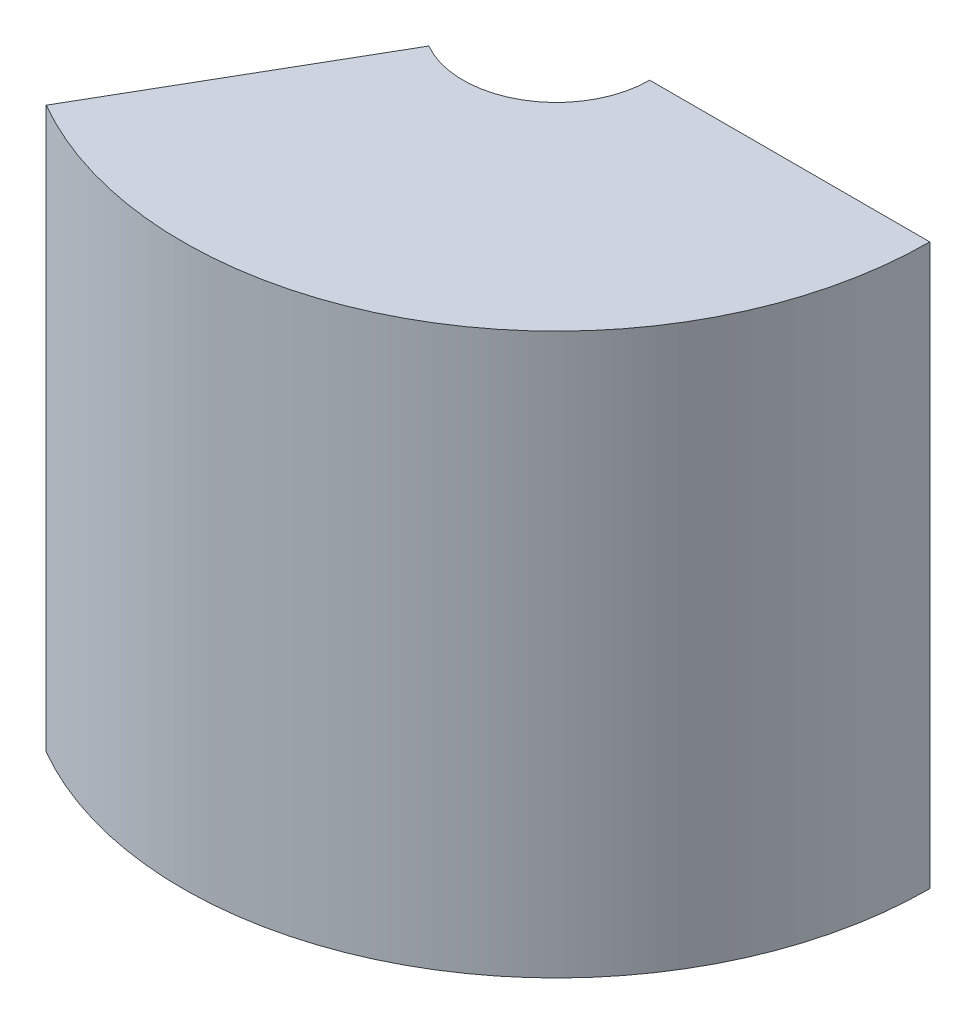
ISO-10303-21;
HEADER;
FILE_DESCRIPTION(('STEP AP214'),'2;1');
FILE_NAME('part.step','',(''),(''),'','','');
FILE_SCHEMA(('AUTOMOTIVE_DESIGN { 1 0 10303 214 1 1 1 1 }'));
ENDSEC;
DATA;
#1=APPLICATION_CONTEXT('core data for automotive mechanical design processes');
#2=APPLICATION_PROTOCOL_DEFINITION('international standard','automotive_design',2000,#1);
#3=PRODUCT_CONTEXT('',#1,'mechanical');
#4=PRODUCT('Part','Part','',(#3));
#5=PRODUCT_RELATED_PRODUCT_CATEGORY('part','',(#4));
#6=PRODUCT_DEFINITION_FORMATION('','',#4);
#7=PRODUCT_DEFINITION_CONTEXT('part definition',#1,'design');
#8=PRODUCT_DEFINITION('design','',#6,#7);
#9=PRODUCT_DEFINITION_SHAPE('','',#8);
#10=(LENGTH_UNIT() NAMED_UNIT(*) SI_UNIT(.MILLI.,.METRE.));
#11=(NAMED_UNIT(*) PLANE_ANGLE_UNIT() SI_UNIT($,.RADIAN.));
#12=(NAMED_UNIT(*) SI_UNIT($,.STERADIAN.) SOLID_ANGLE_UNIT());
#13=UNCERTAINTY_MEASURE_WITH_UNIT(LENGTH_MEASURE(1.E-05),#10,'distance_accuracy_value','');
#14=(GEOMETRIC_REPRESENTATION_CONTEXT(3) GLOBAL_UNCERTAINTY_ASSIGNED_CONTEXT((#13)) GLOBAL_UNIT_ASSIGNED_CONTEXT((#10,
#11,#12)) REPRESENTATION_CONTEXT('',''));
#15=CARTESIAN_POINT('',(0.,0.,0.));
#16=DIRECTION('',(0.,0.,1.));
#17=DIRECTION('',(1.,0.,0.));
#18=AXIS2_PLACEMENT_3D('',#15,#16,#17);
#19=CARTESIAN_POINT('',(0.,0.,0.));
#20=DIRECTION('',(0.,1.,0.));
#21=DIRECTION('',(0.,0.,1.));
#22=AXIS2_PLACEMENT_3D('',#19,#20,#21);
#23=CYLINDRICAL_SURFACE('',#22,5.);
#24=CARTESIAN_POINT('',(0.,0.,0.));
#25=DIRECTION('',(0.,1.,0.));
#26=DIRECTION('',(0.,0.,1.));
#27=AXIS2_PLACEMENT_3D('',#24,#25,#26);
#28=CIRCLE('',#27,5.);
#29=CARTESIAN_POINT('',(-2.5,0.,4.33012701892219));
#30=VERTEX_POINT('',#29);
#31=CARTESIAN_POINT('',(5.,0.,0.));
#32=VERTEX_POINT('',#31);
#33=EDGE_CURVE('E11',#30,#32,#28,.T.);
#34=ORIENTED_EDGE('',*,*,#33,.F.);
#35=DIRECTION('',(0.,-1.,0.));
#36=VECTOR('',#35,1.);
#37=CARTESIAN_POINT('',(-2.5,30.,4.33012701892219));
#38=LINE('',#37,#36);
#39=CARTESIAN_POINT('',(-2.5,30.,4.33012701892219));
#40=VERTEX_POINT('',#39);
#41=EDGE_CURVE('E103',#40,#30,#38,.T.);
#42=ORIENTED_EDGE('',*,*,#41,.F.);
#43=CARTESIAN_POINT('',(0.,30.,0.));
#44=DIRECTION('',(0.,1.,0.));
#45=DIRECTION('',(0.,0.,1.));
#46=AXIS2_PLACEMENT_3D('',#43,#44,#45);
#47=CIRCLE('',#46,5.);
#48=CARTESIAN_POINT('',(5.,30.,0.));
#49=VERTEX_POINT('',#48);
#50=EDGE_CURVE('E56',#40,#49,#47,.T.);
#51=ORIENTED_EDGE('',*,*,#50,.T.);
#52=DIRECTION('',(0.,-1.,0.));
#53=VECTOR('',#52,1.);
#54=CARTESIAN_POINT('',(5.,30.,0.));
#55=LINE('',#54,#53);
#56=EDGE_CURVE('E92',#49,#32,#55,.T.);
#57=ORIENTED_EDGE('',*,*,#56,.T.);
#58=EDGE_LOOP('',(#34,#42,#51,#57));
#59=FACE_BOUND('',#58,.T.);
#60=ADVANCED_FACE('F41',(#59),#23,.F.);
#61=CARTESIAN_POINT('',(-2.5,0.,4.33012701892219));
#62=DIRECTION('',(0.,1.,0.));
#63=DIRECTION('',(0.,0.,1.));
#64=AXIS2_PLACEMENT_3D('',#61,#62,#63);
#65=PLANE('',#64);
#66=CARTESIAN_POINT('',(0.,0.,0.));
#67=DIRECTION('',(0.,1.,0.));
#68=DIRECTION('',(0.,0.,1.));
#69=AXIS2_PLACEMENT_3D('',#66,#67,#68);
#70=CIRCLE('',#69,20.);
#71=CARTESIAN_POINT('',(-9.99999999999999,0.,17.3205080756888));
#72=VERTEX_POINT('',#71);
#73=CARTESIAN_POINT('',(20.,0.,0.));
#74=VERTEX_POINT('',#73);
#75=EDGE_CURVE('E49',#72,#74,#70,.T.);
#76=ORIENTED_EDGE('',*,*,#75,.F.);
#77=DIRECTION('',(-0.5,0.,0.866025403784439));
#78=VECTOR('',#77,1.);
#79=CARTESIAN_POINT('',(-2.5,0.,4.33012701892219));
#80=LINE('',#79,#78);
#81=EDGE_CURVE('E88',#30,#72,#80,.T.);
#82=ORIENTED_EDGE('',*,*,#81,.F.);
#83=ORIENTED_EDGE('',*,*,#33,.T.);
#84=DIRECTION('',(1.,0.,0.));
#85=VECTOR('',#84,1.);
#86=CARTESIAN_POINT('',(5.,0.,0.));
#87=LINE('',#86,#85);
#88=EDGE_CURVE('E85',#32,#74,#87,.T.);
#89=ORIENTED_EDGE('',*,*,#88,.T.);
#90=EDGE_LOOP('',(#76,#82,#83,#89));
#91=FACE_BOUND('',#90,.T.);
#92=ADVANCED_FACE('F43',(#91),#65,.F.);
#93=CARTESIAN_POINT('',(0.,0.,0.));
#94=DIRECTION('',(0.,1.,0.));
#95=DIRECTION('',(0.,0.,1.));
#96=AXIS2_PLACEMENT_3D('',#93,#94,#95);
#97=CYLINDRICAL_SURFACE('',#96,20.);
#98=CARTESIAN_POINT('',(0.,30.,0.));
#99=DIRECTION('',(0.,1.,0.));
#100=DIRECTION('',(0.,0.,1.));
#101=AXIS2_PLACEMENT_3D('',#98,#99,#100);
#102=CIRCLE('',#101,20.);
#103=CARTESIAN_POINT('',(-9.99999999999999,30.,17.3205080756888));
#104=VERTEX_POINT('',#103);
#105=CARTESIAN_POINT('',(20.,30.,0.));
#106=VERTEX_POINT('',#105);
#107=EDGE_CURVE('E64',#104,#106,#102,.T.);
#108=ORIENTED_EDGE('',*,*,#107,.F.);
#109=DIRECTION('',(0.,1.,0.));
#110=VECTOR('',#109,1.);
#111=CARTESIAN_POINT('',(-9.99999999999999,0.,17.3205080756888));
#112=LINE('',#111,#110);
#113=EDGE_CURVE('E106',#72,#104,#112,.T.);
#114=ORIENTED_EDGE('',*,*,#113,.F.);
#115=ORIENTED_EDGE('',*,*,#75,.T.);
#116=DIRECTION('',(0.,1.,0.));
#117=VECTOR('',#116,1.);
#118=CARTESIAN_POINT('',(20.,0.,0.));
#119=LINE('',#118,#117);
#120=EDGE_CURVE('E97',#74,#106,#119,.T.);
#121=ORIENTED_EDGE('',*,*,#120,.T.);
#122=EDGE_LOOP('',(#108,#114,#115,#121));
#123=FACE_BOUND('',#122,.T.);
#124=ADVANCED_FACE('F112',(#123),#97,.T.);
#125=CARTESIAN_POINT('',(-9.99999999999999,30.,17.3205080756888));
#126=DIRECTION('',(0.,-1.,0.));
#127=DIRECTION('',(0.,0.,-1.));
#128=AXIS2_PLACEMENT_3D('',#125,#126,#127);
#129=PLANE('',#128);
#130=DIRECTION('',(0.5,0.,-0.866025403784439));
#131=VECTOR('',#130,1.);
#132=CARTESIAN_POINT('',(-9.99999999999999,30.,17.3205080756888));
#133=LINE('',#132,#131);
#134=EDGE_CURVE('E108',#104,#40,#133,.T.);
#135=ORIENTED_EDGE('',*,*,#134,.F.);
#136=ORIENTED_EDGE('',*,*,#107,.T.);
#137=DIRECTION('',(-1.,0.,0.));
#138=VECTOR('',#137,1.);
#139=CARTESIAN_POINT('',(20.,30.,0.));
#140=LINE('',#139,#138);
#141=EDGE_CURVE('E99',#106,#49,#140,.T.);
#142=ORIENTED_EDGE('',*,*,#141,.T.);
#143=ORIENTED_EDGE('',*,*,#50,.F.);
#144=EDGE_LOOP('',(#135,#136,#142,#143));
#145=FACE_BOUND('',#144,.T.);
#146=ADVANCED_FACE('F115',(#145),#129,.F.);
#147=CARTESIAN_POINT('',(0.,0.,0.));
#148=DIRECTION('',(-0.866025403784439,0.,-0.5));
#149=DIRECTION('',(-0.5,0.,0.866025403784439));
#150=AXIS2_PLACEMENT_3D('',#147,#148,#149);
#151=PLANE('',#150);
#152=ORIENTED_EDGE('',*,*,#41,.T.);
#153=ORIENTED_EDGE('',*,*,#81,.T.);
#154=ORIENTED_EDGE('',*,*,#113,.T.);
#155=ORIENTED_EDGE('',*,*,#134,.T.);
#156=EDGE_LOOP('',(#152,#153,#154,#155));
#157=FACE_BOUND('',#156,.T.);
#158=ADVANCED_FACE('F114',(#157),#151,.T.);
#159=CARTESIAN_POINT('',(0.,0.,0.));
#160=DIRECTION('',(0.,0.,1.));
#161=DIRECTION('',(1.,0.,0.));
#162=AXIS2_PLACEMENT_3D('',#159,#160,#161);
#163=PLANE('',#162);
#164=ORIENTED_EDGE('',*,*,#56,.F.);
#165=ORIENTED_EDGE('',*,*,#141,.F.);
#166=ORIENTED_EDGE('',*,*,#120,.F.);
#167=ORIENTED_EDGE('',*,*,#88,.F.);
#168=EDGE_LOOP('',(#164,#165,#166,#167));
#169=FACE_BOUND('',#168,.T.);
#170=ADVANCED_FACE('F96',(#169),#163,.F.);
#171=CLOSED_SHELL('',(#60,#92,#124,#146,#158,#170));
#172=MANIFOLD_SOLID_BREP('B2',#171);
#173=ADVANCED_BREP_SHAPE_REPRESENTATION('',(#18,#172),#14);
#174=SHAPE_DEFINITION_REPRESENTATION(#9,#173);
ENDSEC;
END-ISO-10303-21;
